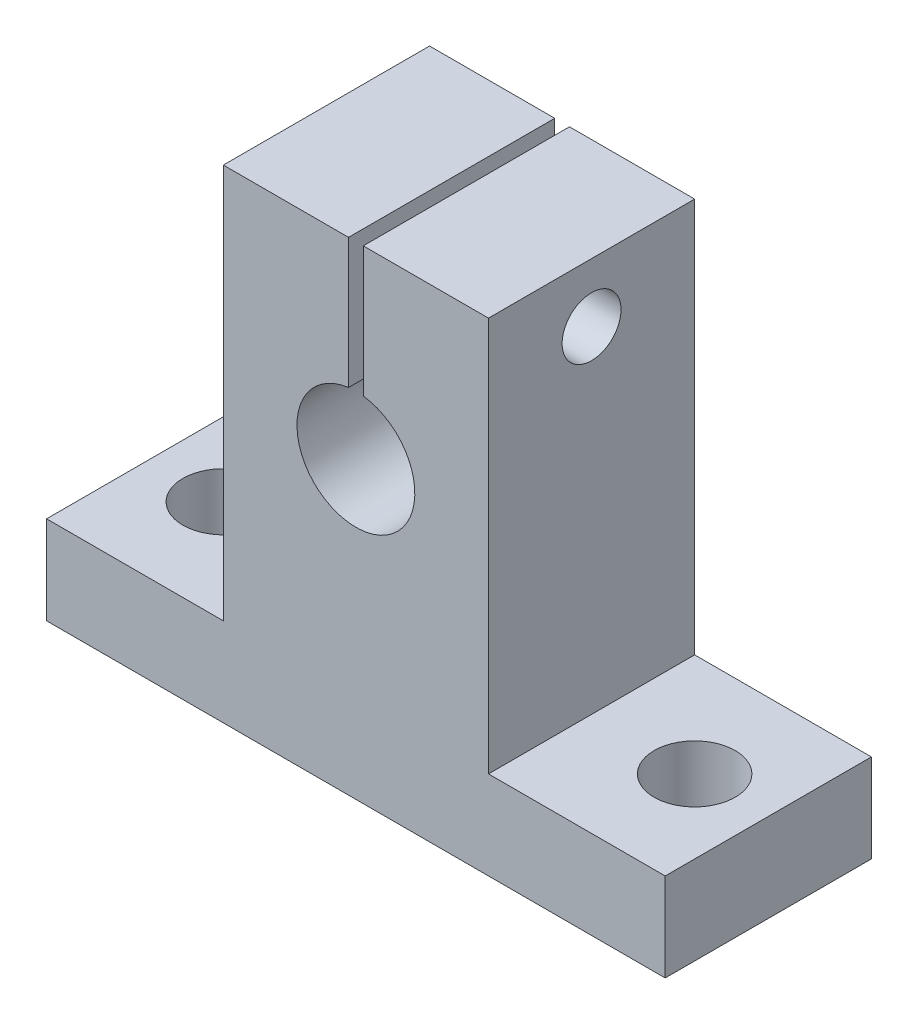
ISO-10303-21;
HEADER;
FILE_DESCRIPTION(('STEP AP214'),'2;1');
FILE_NAME('part.step','',(''),(''),'','','');
FILE_SCHEMA(('AUTOMOTIVE_DESIGN { 1 0 10303 214 1 1 1 1 }'));
ENDSEC;
DATA;
#1=APPLICATION_CONTEXT('core data for automotive mechanical design processes');
#2=APPLICATION_PROTOCOL_DEFINITION('international standard','automotive_design',2000,#1);
#3=PRODUCT_CONTEXT('',#1,'mechanical');
#4=PRODUCT('Part','Part','',(#3));
#5=PRODUCT_RELATED_PRODUCT_CATEGORY('part','',(#4));
#6=PRODUCT_DEFINITION_FORMATION('','',#4);
#7=PRODUCT_DEFINITION_CONTEXT('part definition',#1,'design');
#8=PRODUCT_DEFINITION('design','',#6,#7);
#9=PRODUCT_DEFINITION_SHAPE('','',#8);
#10=(LENGTH_UNIT() NAMED_UNIT(*) SI_UNIT(.MILLI.,.METRE.));
#11=(NAMED_UNIT(*) PLANE_ANGLE_UNIT() SI_UNIT($,.RADIAN.));
#12=(NAMED_UNIT(*) SI_UNIT($,.STERADIAN.) SOLID_ANGLE_UNIT());
#13=UNCERTAINTY_MEASURE_WITH_UNIT(LENGTH_MEASURE(1.E-05),#10,'distance_accuracy_value','');
#14=(GEOMETRIC_REPRESENTATION_CONTEXT(3) GLOBAL_UNCERTAINTY_ASSIGNED_CONTEXT((#13)) GLOBAL_UNIT_ASSIGNED_CONTEXT((#10,
#11,#12)) REPRESENTATION_CONTEXT('',''));
#15=CARTESIAN_POINT('',(0.,0.,0.));
#16=DIRECTION('',(0.,0.,1.));
#17=DIRECTION('',(1.,0.,0.));
#18=AXIS2_PLACEMENT_3D('',#15,#16,#17);
#19=CARTESIAN_POINT('',(0.,0.,14.));
#20=DIRECTION('',(0.,0.,-1.));
#21=DIRECTION('',(-1.,0.,0.));
#22=AXIS2_PLACEMENT_3D('',#19,#20,#21);
#23=PLANE('',#22);
#24=DIRECTION('',(0.,-1.,0.));
#25=VECTOR('',#24,1.);
#26=CARTESIAN_POINT('',(0.5,32.8,14.));
#27=LINE('',#26,#25);
#28=CARTESIAN_POINT('',(0.5,32.8,14.));
#29=VERTEX_POINT('',#28);
#30=CARTESIAN_POINT('',(0.500000000000001,23.9686269665969,14.));
#31=VERTEX_POINT('',#30);
#32=EDGE_CURVE('E123',#29,#31,#27,.T.);
#33=ORIENTED_EDGE('',*,*,#32,.T.);
#34=CARTESIAN_POINT('',(0.,20.,14.));
#35=DIRECTION('',(0.,0.,1.));
#36=DIRECTION('',(1.,0.,0.));
#37=AXIS2_PLACEMENT_3D('',#34,#35,#36);
#38=CIRCLE('',#37,4.);
#39=CARTESIAN_POINT('',(-0.499999999999999,23.9686269665969,14.));
#40=VERTEX_POINT('',#39);
#41=EDGE_CURVE('E161',#40,#31,#38,.T.);
#42=ORIENTED_EDGE('',*,*,#41,.F.);
#43=DIRECTION('',(0.,-1.,0.));
#44=VECTOR('',#43,1.);
#45=CARTESIAN_POINT('',(-0.5,32.8,14.));
#46=LINE('',#45,#44);
#47=CARTESIAN_POINT('',(-0.5,32.8,14.));
#48=VERTEX_POINT('',#47);
#49=EDGE_CURVE('E59',#48,#40,#46,.T.);
#50=ORIENTED_EDGE('',*,*,#49,.F.);
#51=DIRECTION('',(-1.,0.,0.));
#52=VECTOR('',#51,1.);
#53=CARTESIAN_POINT('',(-9.00000000000001,32.8,14.));
#54=LINE('',#53,#52);
#55=CARTESIAN_POINT('',(-9.00000000000001,32.8,14.));
#56=VERTEX_POINT('',#55);
#57=EDGE_CURVE('E148',#48,#56,#54,.T.);
#58=ORIENTED_EDGE('',*,*,#57,.T.);
#59=DIRECTION('',(0.,-1.,0.));
#60=VECTOR('',#59,1.);
#61=CARTESIAN_POINT('',(-9.,6.,14.));
#62=LINE('',#61,#60);
#63=CARTESIAN_POINT('',(-9.,6.,14.));
#64=VERTEX_POINT('',#63);
#65=EDGE_CURVE('E147',#56,#64,#62,.T.);
#66=ORIENTED_EDGE('',*,*,#65,.T.);
#67=DIRECTION('',(-1.,0.,0.));
#68=VECTOR('',#67,1.);
#69=CARTESIAN_POINT('',(-21.,6.,14.));
#70=LINE('',#69,#68);
#71=CARTESIAN_POINT('',(-21.,6.,14.));
#72=VERTEX_POINT('',#71);
#73=EDGE_CURVE('E150',#64,#72,#70,.T.);
#74=ORIENTED_EDGE('',*,*,#73,.T.);
#75=DIRECTION('',(0.,-1.,0.));
#76=VECTOR('',#75,1.);
#77=CARTESIAN_POINT('',(-21.,0.,14.));
#78=LINE('',#77,#76);
#79=CARTESIAN_POINT('',(-21.,0.,14.));
#80=VERTEX_POINT('',#79);
#81=EDGE_CURVE('E175',#72,#80,#78,.T.);
#82=ORIENTED_EDGE('',*,*,#81,.T.);
#83=DIRECTION('',(1.,0.,0.));
#84=VECTOR('',#83,1.);
#85=CARTESIAN_POINT('',(-21.,0.,14.));
#86=LINE('',#85,#84);
#87=CARTESIAN_POINT('',(21.,0.,14.));
#88=VERTEX_POINT('',#87);
#89=EDGE_CURVE('E217',#80,#88,#86,.T.);
#90=ORIENTED_EDGE('',*,*,#89,.T.);
#91=DIRECTION('',(0.,1.,0.));
#92=VECTOR('',#91,1.);
#93=CARTESIAN_POINT('',(21.,0.,14.));
#94=LINE('',#93,#92);
#95=CARTESIAN_POINT('',(21.,6.00000000000001,14.));
#96=VERTEX_POINT('',#95);
#97=EDGE_CURVE('E219',#88,#96,#94,.T.);
#98=ORIENTED_EDGE('',*,*,#97,.T.);
#99=DIRECTION('',(-1.,0.,0.));
#100=VECTOR('',#99,1.);
#101=CARTESIAN_POINT('',(9.,6.,14.));
#102=LINE('',#101,#100);
#103=CARTESIAN_POINT('',(9.,6.,14.));
#104=VERTEX_POINT('',#103);
#105=EDGE_CURVE('E220',#96,#104,#102,.T.);
#106=ORIENTED_EDGE('',*,*,#105,.T.);
#107=DIRECTION('',(0.,1.,0.));
#108=VECTOR('',#107,1.);
#109=CARTESIAN_POINT('',(9.,6.,14.));
#110=LINE('',#109,#108);
#111=CARTESIAN_POINT('',(9.,32.8,14.));
#112=VERTEX_POINT('',#111);
#113=EDGE_CURVE('E145',#104,#112,#110,.T.);
#114=ORIENTED_EDGE('',*,*,#113,.T.);
#115=EDGE_CURVE('E138',#112,#29,#54,.T.);
#116=ORIENTED_EDGE('',*,*,#115,.T.);
#117=EDGE_LOOP('',(#33,#42,#50,#58,#66,#74,#82,#90,#98,#106,#114,#116));
#118=FACE_BOUND('',#117,.T.);
#119=ADVANCED_FACE('F36',(#118),#23,.F.);
#120=CARTESIAN_POINT('',(0.,0.,0.));
#121=DIRECTION('',(0.,0.,-1.));
#122=DIRECTION('',(-1.,0.,0.));
#123=AXIS2_PLACEMENT_3D('',#120,#121,#122);
#124=PLANE('',#123);
#125=CARTESIAN_POINT('',(0.,20.,0.));
#126=DIRECTION('',(0.,0.,1.));
#127=DIRECTION('',(1.,0.,0.));
#128=AXIS2_PLACEMENT_3D('',#125,#126,#127);
#129=CIRCLE('',#128,4.);
#130=CARTESIAN_POINT('',(-0.499999999999999,23.9686269665969,0.));
#131=VERTEX_POINT('',#130);
#132=CARTESIAN_POINT('',(0.500000000000001,23.9686269665969,0.));
#133=VERTEX_POINT('',#132);
#134=EDGE_CURVE('E207',#131,#133,#129,.T.);
#135=ORIENTED_EDGE('',*,*,#134,.T.);
#136=DIRECTION('',(0.,1.,0.));
#137=VECTOR('',#136,1.);
#138=CARTESIAN_POINT('',(0.500000000000003,0.,0.));
#139=LINE('',#138,#137);
#140=CARTESIAN_POINT('',(0.5,32.8,0.));
#141=VERTEX_POINT('',#140);
#142=EDGE_CURVE('E52',#133,#141,#139,.T.);
#143=ORIENTED_EDGE('',*,*,#142,.T.);
#144=DIRECTION('',(-1.,0.,0.));
#145=VECTOR('',#144,1.);
#146=CARTESIAN_POINT('',(-9.00000000000001,32.8,0.));
#147=LINE('',#146,#145);
#148=CARTESIAN_POINT('',(9.,32.8,0.));
#149=VERTEX_POINT('',#148);
#150=EDGE_CURVE('E140',#149,#141,#147,.T.);
#151=ORIENTED_EDGE('',*,*,#150,.F.);
#152=DIRECTION('',(0.,1.,0.));
#153=VECTOR('',#152,1.);
#154=CARTESIAN_POINT('',(9.,6.,0.));
#155=LINE('',#154,#153);
#156=CARTESIAN_POINT('',(9.,6.,0.));
#157=VERTEX_POINT('',#156);
#158=EDGE_CURVE('E167',#157,#149,#155,.T.);
#159=ORIENTED_EDGE('',*,*,#158,.F.);
#160=DIRECTION('',(-1.,0.,0.));
#161=VECTOR('',#160,1.);
#162=CARTESIAN_POINT('',(9.,6.,0.));
#163=LINE('',#162,#161);
#164=CARTESIAN_POINT('',(21.,6.00000000000001,0.));
#165=VERTEX_POINT('',#164);
#166=EDGE_CURVE('E165',#165,#157,#163,.T.);
#167=ORIENTED_EDGE('',*,*,#166,.F.);
#168=DIRECTION('',(0.,1.,0.));
#169=VECTOR('',#168,1.);
#170=CARTESIAN_POINT('',(21.,0.,0.));
#171=LINE('',#170,#169);
#172=CARTESIAN_POINT('',(21.,0.,0.));
#173=VERTEX_POINT('',#172);
#174=EDGE_CURVE('E163',#173,#165,#171,.T.);
#175=ORIENTED_EDGE('',*,*,#174,.F.);
#176=DIRECTION('',(1.,0.,0.));
#177=VECTOR('',#176,1.);
#178=CARTESIAN_POINT('',(-21.,0.,0.));
#179=LINE('',#178,#177);
#180=CARTESIAN_POINT('',(-21.,0.,0.));
#181=VERTEX_POINT('',#180);
#182=EDGE_CURVE('E160',#181,#173,#179,.T.);
#183=ORIENTED_EDGE('',*,*,#182,.F.);
#184=DIRECTION('',(0.,-1.,0.));
#185=VECTOR('',#184,1.);
#186=CARTESIAN_POINT('',(-21.,0.,0.));
#187=LINE('',#186,#185);
#188=CARTESIAN_POINT('',(-21.,6.,0.));
#189=VERTEX_POINT('',#188);
#190=EDGE_CURVE('E157',#189,#181,#187,.T.);
#191=ORIENTED_EDGE('',*,*,#190,.F.);
#192=DIRECTION('',(-1.,0.,0.));
#193=VECTOR('',#192,1.);
#194=CARTESIAN_POINT('',(-21.,6.,0.));
#195=LINE('',#194,#193);
#196=CARTESIAN_POINT('',(-9.,6.,0.));
#197=VERTEX_POINT('',#196);
#198=EDGE_CURVE('E173',#197,#189,#195,.T.);
#199=ORIENTED_EDGE('',*,*,#198,.F.);
#200=DIRECTION('',(0.,-1.,0.));
#201=VECTOR('',#200,1.);
#202=CARTESIAN_POINT('',(-9.,6.,0.));
#203=LINE('',#202,#201);
#204=CARTESIAN_POINT('',(-9.00000000000001,32.8,0.));
#205=VERTEX_POINT('',#204);
#206=EDGE_CURVE('E171',#205,#197,#203,.T.);
#207=ORIENTED_EDGE('',*,*,#206,.F.);
#208=CARTESIAN_POINT('',(-0.5,32.8,0.));
#209=VERTEX_POINT('',#208);
#210=EDGE_CURVE('E169',#209,#205,#147,.T.);
#211=ORIENTED_EDGE('',*,*,#210,.F.);
#212=DIRECTION('',(0.,1.,0.));
#213=VECTOR('',#212,1.);
#214=CARTESIAN_POINT('',(-0.499999999999996,0.,0.));
#215=LINE('',#214,#213);
#216=EDGE_CURVE('E141',#131,#209,#215,.T.);
#217=ORIENTED_EDGE('',*,*,#216,.F.);
#218=EDGE_LOOP('',(#135,#143,#151,#159,#167,#175,#183,#191,#199,#207,#211,#217));
#219=FACE_BOUND('',#218,.T.);
#220=ADVANCED_FACE('F206',(#219),#124,.T.);
#221=CARTESIAN_POINT('',(-9.00000000000001,32.8,14.));
#222=DIRECTION('',(0.,-1.,0.));
#223=DIRECTION('',(0.,0.,-1.));
#224=AXIS2_PLACEMENT_3D('',#221,#222,#223);
#225=PLANE('',#224);
#226=DIRECTION('',(0.,0.,1.));
#227=VECTOR('',#226,1.);
#228=CARTESIAN_POINT('',(0.5,32.8,-5.));
#229=LINE('',#228,#227);
#230=EDGE_CURVE('E126',#141,#29,#229,.T.);
#231=ORIENTED_EDGE('',*,*,#230,.T.);
#232=ORIENTED_EDGE('',*,*,#115,.F.);
#233=DIRECTION('',(0.,0.,-1.));
#234=VECTOR('',#233,1.);
#235=CARTESIAN_POINT('',(9.,32.8,14.));
#236=LINE('',#235,#234);
#237=EDGE_CURVE('E184',#112,#149,#236,.T.);
#238=ORIENTED_EDGE('',*,*,#237,.T.);
#239=ORIENTED_EDGE('',*,*,#150,.T.);
#240=EDGE_LOOP('',(#231,#232,#238,#239));
#241=FACE_BOUND('',#240,.T.);
#242=ADVANCED_FACE('F136',(#241),#225,.F.);
#243=CARTESIAN_POINT('',(0.,20.,14.));
#244=DIRECTION('',(0.,0.,-1.));
#245=DIRECTION('',(-1.,0.,0.));
#246=AXIS2_PLACEMENT_3D('',#243,#244,#245);
#247=CYLINDRICAL_SURFACE('',#246,4.);
#248=ORIENTED_EDGE('',*,*,#41,.T.);
#249=DIRECTION('',(0.,0.,-1.));
#250=VECTOR('',#249,1.);
#251=CARTESIAN_POINT('',(0.500000000000001,23.9686269665969,14.));
#252=LINE('',#251,#250);
#253=EDGE_CURVE('E11',#31,#133,#252,.T.);
#254=ORIENTED_EDGE('',*,*,#253,.T.);
#255=ORIENTED_EDGE('',*,*,#134,.F.);
#256=DIRECTION('',(0.,0.,-1.));
#257=VECTOR('',#256,1.);
#258=CARTESIAN_POINT('',(-0.499999999999999,23.9686269665969,14.));
#259=LINE('',#258,#257);
#260=EDGE_CURVE('E45',#40,#131,#259,.T.);
#261=ORIENTED_EDGE('',*,*,#260,.F.);
#262=EDGE_LOOP('',(#248,#254,#255,#261));
#263=FACE_BOUND('',#262,.T.);
#264=ADVANCED_FACE('F210',(#263),#247,.F.);
#265=CARTESIAN_POINT('',(-21.,0.,14.));
#266=DIRECTION('',(1.,0.,0.));
#267=DIRECTION('',(0.,0.,-1.));
#268=AXIS2_PLACEMENT_3D('',#265,#266,#267);
#269=PLANE('',#268);
#270=ORIENTED_EDGE('',*,*,#190,.T.);
#271=DIRECTION('',(0.,0.,-1.));
#272=VECTOR('',#271,1.);
#273=CARTESIAN_POINT('',(-21.,0.,14.));
#274=LINE('',#273,#272);
#275=EDGE_CURVE('E195',#80,#181,#274,.T.);
#276=ORIENTED_EDGE('',*,*,#275,.F.);
#277=ORIENTED_EDGE('',*,*,#81,.F.);
#278=DIRECTION('',(0.,0.,-1.));
#279=VECTOR('',#278,1.);
#280=CARTESIAN_POINT('',(-21.,6.,14.));
#281=LINE('',#280,#279);
#282=EDGE_CURVE('E156',#72,#189,#281,.T.);
#283=ORIENTED_EDGE('',*,*,#282,.T.);
#284=EDGE_LOOP('',(#270,#276,#277,#283));
#285=FACE_BOUND('',#284,.T.);
#286=ADVANCED_FACE('F38',(#285),#269,.F.);
#287=CARTESIAN_POINT('',(-21.,0.,14.));
#288=DIRECTION('',(0.,1.,0.));
#289=DIRECTION('',(-1.,0.,0.));
#290=AXIS2_PLACEMENT_3D('',#287,#288,#289);
#291=PLANE('',#290);
#292=CARTESIAN_POINT('',(16.,0.,7.));
#293=DIRECTION('',(0.,1.,0.));
#294=DIRECTION('',(-1.,0.,0.));
#295=AXIS2_PLACEMENT_3D('',#292,#293,#294);
#296=CIRCLE('',#295,2.75);
#297=CARTESIAN_POINT('',(13.25,0.,7.));
#298=VERTEX_POINT('',#297);
#299=EDGE_CURVE('E265',#298,#298,#296,.T.);
#300=ORIENTED_EDGE('',*,*,#299,.T.);
#301=EDGE_LOOP('',(#300));
#302=FACE_BOUND('',#301,.T.);
#303=CARTESIAN_POINT('',(-16.,0.,6.99999999999999));
#304=DIRECTION('',(0.,1.,0.));
#305=DIRECTION('',(-1.,0.,0.));
#306=AXIS2_PLACEMENT_3D('',#303,#304,#305);
#307=CIRCLE('',#306,2.75);
#308=CARTESIAN_POINT('',(-18.75,0.,6.99999999999999));
#309=VERTEX_POINT('',#308);
#310=EDGE_CURVE('E268',#309,#309,#307,.T.);
#311=ORIENTED_EDGE('',*,*,#310,.T.);
#312=EDGE_LOOP('',(#311));
#313=FACE_BOUND('',#312,.T.);
#314=ORIENTED_EDGE('',*,*,#182,.T.);
#315=DIRECTION('',(0.,0.,-1.));
#316=VECTOR('',#315,1.);
#317=CARTESIAN_POINT('',(21.,0.,14.));
#318=LINE('',#317,#316);
#319=EDGE_CURVE('E192',#88,#173,#318,.T.);
#320=ORIENTED_EDGE('',*,*,#319,.F.);
#321=ORIENTED_EDGE('',*,*,#89,.F.);
#322=ORIENTED_EDGE('',*,*,#275,.T.);
#323=EDGE_LOOP('',(#314,#320,#321,#322));
#324=FACE_BOUND('',#323,.T.);
#325=ADVANCED_FACE('F237',(#302,#313,#324),#291,.F.);
#326=CARTESIAN_POINT('',(21.,0.,14.));
#327=DIRECTION('',(-1.,0.,0.));
#328=DIRECTION('',(0.,0.,1.));
#329=AXIS2_PLACEMENT_3D('',#326,#327,#328);
#330=PLANE('',#329);
#331=ORIENTED_EDGE('',*,*,#174,.T.);
#332=DIRECTION('',(0.,0.,-1.));
#333=VECTOR('',#332,1.);
#334=CARTESIAN_POINT('',(21.,6.00000000000001,14.));
#335=LINE('',#334,#333);
#336=EDGE_CURVE('E189',#96,#165,#335,.T.);
#337=ORIENTED_EDGE('',*,*,#336,.F.);
#338=ORIENTED_EDGE('',*,*,#97,.F.);
#339=ORIENTED_EDGE('',*,*,#319,.T.);
#340=EDGE_LOOP('',(#331,#337,#338,#339));
#341=FACE_BOUND('',#340,.T.);
#342=ADVANCED_FACE('F234',(#341),#330,.F.);
#343=CARTESIAN_POINT('',(9.,6.,14.));
#344=DIRECTION('',(0.,-1.,0.));
#345=DIRECTION('',(1.,0.,0.));
#346=AXIS2_PLACEMENT_3D('',#343,#344,#345);
#347=PLANE('',#346);
#348=CARTESIAN_POINT('',(16.,6.,7.));
#349=DIRECTION('',(0.,1.,0.));
#350=DIRECTION('',(-1.,0.,0.));
#351=AXIS2_PLACEMENT_3D('',#348,#349,#350);
#352=CIRCLE('',#351,2.75);
#353=CARTESIAN_POINT('',(13.25,6.,7.));
#354=VERTEX_POINT('',#353);
#355=EDGE_CURVE('E271',#354,#354,#352,.T.);
#356=ORIENTED_EDGE('',*,*,#355,.F.);
#357=EDGE_LOOP('',(#356));
#358=FACE_BOUND('',#357,.T.);
#359=ORIENTED_EDGE('',*,*,#166,.T.);
#360=DIRECTION('',(0.,0.,-1.));
#361=VECTOR('',#360,1.);
#362=CARTESIAN_POINT('',(9.,6.,14.));
#363=LINE('',#362,#361);
#364=EDGE_CURVE('E186',#104,#157,#363,.T.);
#365=ORIENTED_EDGE('',*,*,#364,.F.);
#366=ORIENTED_EDGE('',*,*,#105,.F.);
#367=ORIENTED_EDGE('',*,*,#336,.T.);
#368=EDGE_LOOP('',(#359,#365,#366,#367));
#369=FACE_BOUND('',#368,.T.);
#370=ADVANCED_FACE('F226',(#358,#369),#347,.F.);
#371=CARTESIAN_POINT('',(9.,6.,14.));
#372=DIRECTION('',(-1.,0.,0.));
#373=DIRECTION('',(0.,0.,1.));
#374=AXIS2_PLACEMENT_3D('',#371,#372,#373);
#375=PLANE('',#374);
#376=CARTESIAN_POINT('',(9.,28.8,7.));
#377=DIRECTION('',(1.,0.,0.));
#378=DIRECTION('',(0.,0.,-1.));
#379=AXIS2_PLACEMENT_3D('',#376,#377,#378);
#380=CIRCLE('',#379,2.);
#381=CARTESIAN_POINT('',(9.,28.8,5.));
#382=VERTEX_POINT('',#381);
#383=EDGE_CURVE('E262',#382,#382,#380,.T.);
#384=ORIENTED_EDGE('',*,*,#383,.F.);
#385=EDGE_LOOP('',(#384));
#386=FACE_BOUND('',#385,.T.);
#387=ORIENTED_EDGE('',*,*,#158,.T.);
#388=ORIENTED_EDGE('',*,*,#237,.F.);
#389=ORIENTED_EDGE('',*,*,#113,.F.);
#390=ORIENTED_EDGE('',*,*,#364,.T.);
#391=EDGE_LOOP('',(#387,#388,#389,#390));
#392=FACE_BOUND('',#391,.T.);
#393=ADVANCED_FACE('F230',(#386,#392),#375,.F.);
#394=ORIENTED_EDGE('',*,*,#57,.F.);
#395=DIRECTION('',(0.,0.,1.));
#396=VECTOR('',#395,1.);
#397=CARTESIAN_POINT('',(-0.5,32.8,-5.));
#398=LINE('',#397,#396);
#399=EDGE_CURVE('E142',#209,#48,#398,.T.);
#400=ORIENTED_EDGE('',*,*,#399,.F.);
#401=ORIENTED_EDGE('',*,*,#210,.T.);
#402=DIRECTION('',(0.,0.,-1.));
#403=VECTOR('',#402,1.);
#404=CARTESIAN_POINT('',(-9.00000000000001,32.8,14.));
#405=LINE('',#404,#403);
#406=EDGE_CURVE('E181',#56,#205,#405,.T.);
#407=ORIENTED_EDGE('',*,*,#406,.F.);
#408=EDGE_LOOP('',(#394,#400,#401,#407));
#409=FACE_BOUND('',#408,.T.);
#410=ADVANCED_FACE('F253',(#409),#225,.F.);
#411=CARTESIAN_POINT('',(-9.,6.,14.));
#412=DIRECTION('',(1.,0.,0.));
#413=DIRECTION('',(0.,1.,0.));
#414=AXIS2_PLACEMENT_3D('',#411,#412,#413);
#415=PLANE('',#414);
#416=CARTESIAN_POINT('',(-9.,28.8,7.));
#417=DIRECTION('',(1.,0.,0.));
#418=DIRECTION('',(0.,1.,0.));
#419=AXIS2_PLACEMENT_3D('',#416,#417,#418);
#420=CIRCLE('',#419,2.);
#421=CARTESIAN_POINT('',(-9.,30.8,7.));
#422=VERTEX_POINT('',#421);
#423=EDGE_CURVE('E131',#422,#422,#420,.T.);
#424=ORIENTED_EDGE('',*,*,#423,.T.);
#425=EDGE_LOOP('',(#424));
#426=FACE_BOUND('',#425,.T.);
#427=ORIENTED_EDGE('',*,*,#206,.T.);
#428=DIRECTION('',(0.,0.,-1.));
#429=VECTOR('',#428,1.);
#430=CARTESIAN_POINT('',(-9.,6.,14.));
#431=LINE('',#430,#429);
#432=EDGE_CURVE('E178',#64,#197,#431,.T.);
#433=ORIENTED_EDGE('',*,*,#432,.F.);
#434=ORIENTED_EDGE('',*,*,#65,.F.);
#435=ORIENTED_EDGE('',*,*,#406,.T.);
#436=EDGE_LOOP('',(#427,#433,#434,#435));
#437=FACE_BOUND('',#436,.T.);
#438=ADVANCED_FACE('F249',(#426,#437),#415,.F.);
#439=CARTESIAN_POINT('',(-21.,6.,14.));
#440=DIRECTION('',(0.,-1.,0.));
#441=DIRECTION('',(0.,0.,-1.));
#442=AXIS2_PLACEMENT_3D('',#439,#440,#441);
#443=PLANE('',#442);
#444=CARTESIAN_POINT('',(-16.,6.,6.99999999999999));
#445=DIRECTION('',(0.,1.,0.));
#446=DIRECTION('',(1.,0.,0.));
#447=AXIS2_PLACEMENT_3D('',#444,#445,#446);
#448=CIRCLE('',#447,2.75);
#449=CARTESIAN_POINT('',(-13.25,6.,6.99999999999999));
#450=VERTEX_POINT('',#449);
#451=EDGE_CURVE('E272',#450,#450,#448,.T.);
#452=ORIENTED_EDGE('',*,*,#451,.F.);
#453=EDGE_LOOP('',(#452));
#454=FACE_BOUND('',#453,.T.);
#455=ORIENTED_EDGE('',*,*,#198,.T.);
#456=ORIENTED_EDGE('',*,*,#282,.F.);
#457=ORIENTED_EDGE('',*,*,#73,.F.);
#458=ORIENTED_EDGE('',*,*,#432,.T.);
#459=EDGE_LOOP('',(#455,#456,#457,#458));
#460=FACE_BOUND('',#459,.T.);
#461=ADVANCED_FACE('F244',(#454,#460),#443,.F.);
#462=CARTESIAN_POINT('',(-0.5,32.8,-5.));
#463=DIRECTION('',(-1.,0.,0.));
#464=DIRECTION('',(0.,-1.,0.));
#465=AXIS2_PLACEMENT_3D('',#462,#463,#464);
#466=PLANE('',#465);
#467=CARTESIAN_POINT('',(-0.5,28.8,7.));
#468=DIRECTION('',(-1.,0.,0.));
#469=DIRECTION('',(0.,-1.,0.));
#470=AXIS2_PLACEMENT_3D('',#467,#468,#469);
#471=CIRCLE('',#470,2.);
#472=CARTESIAN_POINT('',(-0.5,26.8,7.));
#473=VERTEX_POINT('',#472);
#474=EDGE_CURVE('E259',#473,#473,#471,.T.);
#475=ORIENTED_EDGE('',*,*,#474,.T.);
#476=EDGE_LOOP('',(#475));
#477=FACE_BOUND('',#476,.T.);
#478=ORIENTED_EDGE('',*,*,#216,.T.);
#479=ORIENTED_EDGE('',*,*,#399,.T.);
#480=ORIENTED_EDGE('',*,*,#49,.T.);
#481=ORIENTED_EDGE('',*,*,#260,.T.);
#482=EDGE_LOOP('',(#478,#479,#480,#481));
#483=FACE_BOUND('',#482,.T.);
#484=ADVANCED_FACE('F199',(#477,#483),#466,.F.);
#485=CARTESIAN_POINT('',(0.5,32.8,-5.));
#486=DIRECTION('',(-1.,0.,0.));
#487=DIRECTION('',(0.,-1.,0.));
#488=AXIS2_PLACEMENT_3D('',#485,#486,#487);
#489=PLANE('',#488);
#490=CARTESIAN_POINT('',(0.5,28.8,7.));
#491=DIRECTION('',(-1.,0.,0.));
#492=DIRECTION('',(0.,-1.,0.));
#493=AXIS2_PLACEMENT_3D('',#490,#491,#492);
#494=CIRCLE('',#493,2.);
#495=CARTESIAN_POINT('',(0.500000000000001,26.8,7.));
#496=VERTEX_POINT('',#495);
#497=EDGE_CURVE('E40',#496,#496,#494,.T.);
#498=ORIENTED_EDGE('',*,*,#497,.F.);
#499=EDGE_LOOP('',(#498));
#500=FACE_BOUND('',#499,.T.);
#501=ORIENTED_EDGE('',*,*,#253,.F.);
#502=ORIENTED_EDGE('',*,*,#32,.F.);
#503=ORIENTED_EDGE('',*,*,#230,.F.);
#504=ORIENTED_EDGE('',*,*,#142,.F.);
#505=EDGE_LOOP('',(#501,#502,#503,#504));
#506=FACE_BOUND('',#505,.T.);
#507=ADVANCED_FACE('F125',(#500,#506),#489,.T.);
#508=CARTESIAN_POINT('',(-22.,28.8,7.));
#509=DIRECTION('',(1.,0.,0.));
#510=DIRECTION('',(0.,0.,-1.));
#511=AXIS2_PLACEMENT_3D('',#508,#509,#510);
#512=CYLINDRICAL_SURFACE('',#511,2.);
#513=ORIENTED_EDGE('',*,*,#497,.T.);
#514=EDGE_LOOP('',(#513));
#515=FACE_BOUND('',#514,.T.);
#516=ORIENTED_EDGE('',*,*,#383,.T.);
#517=EDGE_LOOP('',(#516));
#518=FACE_BOUND('',#517,.T.);
#519=ADVANCED_FACE('F335',(#515,#518),#512,.F.);
#520=ORIENTED_EDGE('',*,*,#474,.F.);
#521=EDGE_LOOP('',(#520));
#522=FACE_BOUND('',#521,.T.);
#523=ORIENTED_EDGE('',*,*,#423,.F.);
#524=EDGE_LOOP('',(#523));
#525=FACE_BOUND('',#524,.T.);
#526=ADVANCED_FACE('F327',(#522,#525),#512,.F.);
#527=CARTESIAN_POINT('',(-16.,-16.,6.99999999999999));
#528=DIRECTION('',(0.,1.,0.));
#529=DIRECTION('',(-1.,0.,0.));
#530=AXIS2_PLACEMENT_3D('',#527,#528,#529);
#531=CYLINDRICAL_SURFACE('',#530,2.75);
#532=ORIENTED_EDGE('',*,*,#451,.T.);
#533=EDGE_LOOP('',(#532));
#534=FACE_BOUND('',#533,.T.);
#535=ORIENTED_EDGE('',*,*,#310,.F.);
#536=EDGE_LOOP('',(#535));
#537=FACE_BOUND('',#536,.T.);
#538=ADVANCED_FACE('F325',(#534,#537),#531,.F.);
#539=CARTESIAN_POINT('',(16.,-16.,7.));
#540=DIRECTION('',(0.,1.,0.));
#541=DIRECTION('',(-1.,0.,0.));
#542=AXIS2_PLACEMENT_3D('',#539,#540,#541);
#543=CYLINDRICAL_SURFACE('',#542,2.75);
#544=ORIENTED_EDGE('',*,*,#355,.T.);
#545=EDGE_LOOP('',(#544));
#546=FACE_BOUND('',#545,.T.);
#547=ORIENTED_EDGE('',*,*,#299,.F.);
#548=EDGE_LOOP('',(#547));
#549=FACE_BOUND('',#548,.T.);
#550=ADVANCED_FACE('F278',(#546,#549),#543,.F.);
#551=CLOSED_SHELL('',(#119,#220,#242,#264,#286,#325,#342,#370,#393,#410,#438,#461,#484,#507,
#519,#526,#538,#550));
#552=MANIFOLD_SOLID_BREP('B2',#551);
#553=ADVANCED_BREP_SHAPE_REPRESENTATION('',(#18,#552),#14);
#554=SHAPE_DEFINITION_REPRESENTATION(#9,#553);
ENDSEC;
END-ISO-10303-21;
